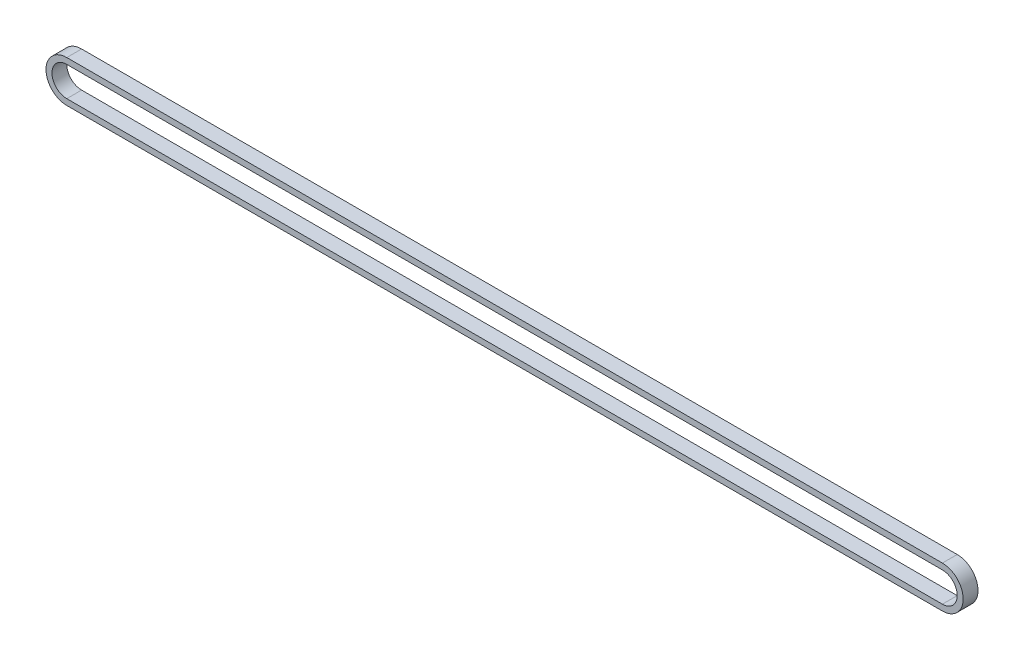
ISO-10303-21;
HEADER;
FILE_DESCRIPTION(('STEP AP214'),'2;1');
FILE_NAME('part.step','',(''),(''),'','','');
FILE_SCHEMA(('AUTOMOTIVE_DESIGN { 1 0 10303 214 1 1 1 1 }'));
ENDSEC;
DATA;
#1=APPLICATION_CONTEXT('core data for automotive mechanical design processes');
#2=APPLICATION_PROTOCOL_DEFINITION('international standard','automotive_design',2000,#1);
#3=PRODUCT_CONTEXT('',#1,'mechanical');
#4=PRODUCT('Part','Part','',(#3));
#5=PRODUCT_RELATED_PRODUCT_CATEGORY('part','',(#4));
#6=PRODUCT_DEFINITION_FORMATION('','',#4);
#7=PRODUCT_DEFINITION_CONTEXT('part definition',#1,'design');
#8=PRODUCT_DEFINITION('design','',#6,#7);
#9=PRODUCT_DEFINITION_SHAPE('','',#8);
#10=(LENGTH_UNIT() NAMED_UNIT(*) SI_UNIT(.MILLI.,.METRE.));
#11=(NAMED_UNIT(*) PLANE_ANGLE_UNIT() SI_UNIT($,.RADIAN.));
#12=(NAMED_UNIT(*) SI_UNIT($,.STERADIAN.) SOLID_ANGLE_UNIT());
#13=UNCERTAINTY_MEASURE_WITH_UNIT(LENGTH_MEASURE(1.E-05),#10,'distance_accuracy_value','');
#14=(GEOMETRIC_REPRESENTATION_CONTEXT(3) GLOBAL_UNCERTAINTY_ASSIGNED_CONTEXT((#13)) GLOBAL_UNIT_ASSIGNED_CONTEXT((#10,
#11,#12)) REPRESENTATION_CONTEXT('',''));
#15=CARTESIAN_POINT('',(0.,0.,0.));
#16=DIRECTION('',(0.,0.,1.));
#17=DIRECTION('',(1.,0.,0.));
#18=AXIS2_PLACEMENT_3D('',#15,#16,#17);
#19=CARTESIAN_POINT('',(-281.746298650699,144.119878603945,10.));
#20=DIRECTION('',(0.,0.,1.));
#21=DIRECTION('',(1.,0.,0.));
#22=AXIS2_PLACEMENT_3D('',#19,#20,#21);
#23=PLANE('',#22);
#24=CARTESIAN_POINT('',(-281.746298650699,144.119878603945,10.));
#25=DIRECTION('',(0.,0.,1.));
#26=DIRECTION('',(1.,0.,0.));
#27=AXIS2_PLACEMENT_3D('',#24,#25,#26);
#28=CIRCLE('',#27,14.);
#29=CARTESIAN_POINT('',(-281.746298650699,158.119878603945,10.));
#30=VERTEX_POINT('',#29);
#31=CARTESIAN_POINT('',(-281.746298650699,130.119878603945,10.));
#32=VERTEX_POINT('',#31);
#33=EDGE_CURVE('E134',#30,#32,#28,.T.);
#34=ORIENTED_EDGE('',*,*,#33,.T.);
#35=DIRECTION('',(1.,0.,0.));
#36=VECTOR('',#35,1.);
#37=CARTESIAN_POINT('',(-281.746298650699,130.119878603945,10.));
#38=LINE('',#37,#36);
#39=CARTESIAN_POINT('',(308.253701349301,130.119878603945,10.));
#40=VERTEX_POINT('',#39);
#41=EDGE_CURVE('E137',#32,#40,#38,.T.);
#42=ORIENTED_EDGE('',*,*,#41,.T.);
#43=CARTESIAN_POINT('',(308.253701349301,144.119878603945,10.));
#44=DIRECTION('',(0.,0.,1.));
#45=DIRECTION('',(-1.,0.,0.));
#46=AXIS2_PLACEMENT_3D('',#43,#44,#45);
#47=CIRCLE('',#46,14.);
#48=CARTESIAN_POINT('',(308.253701349301,158.119878603945,10.));
#49=VERTEX_POINT('',#48);
#50=EDGE_CURVE('E140',#40,#49,#47,.T.);
#51=ORIENTED_EDGE('',*,*,#50,.T.);
#52=DIRECTION('',(-1.,0.,0.));
#53=VECTOR('',#52,1.);
#54=CARTESIAN_POINT('',(-281.746298650699,158.119878603945,10.));
#55=LINE('',#54,#53);
#56=EDGE_CURVE('E142',#49,#30,#55,.T.);
#57=ORIENTED_EDGE('',*,*,#56,.T.);
#58=EDGE_LOOP('',(#34,#42,#51,#57));
#59=FACE_BOUND('',#58,.T.);
#60=DIRECTION('',(1.,0.,0.));
#61=VECTOR('',#60,1.);
#62=CARTESIAN_POINT('',(-281.746298650699,134.119878603945,10.));
#63=LINE('',#62,#61);
#64=CARTESIAN_POINT('',(-281.746298650699,134.119878603945,10.));
#65=VERTEX_POINT('',#64);
#66=CARTESIAN_POINT('',(308.253701349301,134.119878603945,10.));
#67=VERTEX_POINT('',#66);
#68=EDGE_CURVE('E106',#65,#67,#63,.T.);
#69=ORIENTED_EDGE('',*,*,#68,.F.);
#70=CARTESIAN_POINT('',(-281.746298650699,144.119878603945,10.));
#71=DIRECTION('',(0.,0.,1.));
#72=DIRECTION('',(1.,0.,0.));
#73=AXIS2_PLACEMENT_3D('',#70,#71,#72);
#74=CIRCLE('',#73,10.);
#75=CARTESIAN_POINT('',(-281.746298650699,154.119878603945,10.));
#76=VERTEX_POINT('',#75);
#77=EDGE_CURVE('E98',#76,#65,#74,.T.);
#78=ORIENTED_EDGE('',*,*,#77,.F.);
#79=DIRECTION('',(-1.,0.,0.));
#80=VECTOR('',#79,1.);
#81=CARTESIAN_POINT('',(-281.746298650699,154.119878603945,10.));
#82=LINE('',#81,#80);
#83=CARTESIAN_POINT('',(308.253701349301,154.119878603945,10.));
#84=VERTEX_POINT('',#83);
#85=EDGE_CURVE('E120',#84,#76,#82,.T.);
#86=ORIENTED_EDGE('',*,*,#85,.F.);
#87=CARTESIAN_POINT('',(308.253701349301,144.119878603945,10.));
#88=DIRECTION('',(0.,0.,1.));
#89=DIRECTION('',(-1.,0.,0.));
#90=AXIS2_PLACEMENT_3D('',#87,#88,#89);
#91=CIRCLE('',#90,10.);
#92=EDGE_CURVE('E118',#67,#84,#91,.T.);
#93=ORIENTED_EDGE('',*,*,#92,.F.);
#94=EDGE_LOOP('',(#69,#78,#86,#93));
#95=FACE_BOUND('',#94,.T.);
#96=ADVANCED_FACE('F33',(#59,#95),#23,.T.);
#97=CARTESIAN_POINT('',(-281.746298650699,144.119878603945,0.));
#98=DIRECTION('',(0.,0.,1.));
#99=DIRECTION('',(1.,0.,0.));
#100=AXIS2_PLACEMENT_3D('',#97,#98,#99);
#101=PLANE('',#100);
#102=CARTESIAN_POINT('',(-281.746298650699,144.119878603945,0.));
#103=DIRECTION('',(0.,0.,1.));
#104=DIRECTION('',(1.,0.,0.));
#105=AXIS2_PLACEMENT_3D('',#102,#103,#104);
#106=CIRCLE('',#105,14.);
#107=CARTESIAN_POINT('',(-281.746298650699,158.119878603945,0.));
#108=VERTEX_POINT('',#107);
#109=CARTESIAN_POINT('',(-281.746298650699,130.119878603945,0.));
#110=VERTEX_POINT('',#109);
#111=EDGE_CURVE('E114',#108,#110,#106,.T.);
#112=ORIENTED_EDGE('',*,*,#111,.F.);
#113=DIRECTION('',(-1.,0.,0.));
#114=VECTOR('',#113,1.);
#115=CARTESIAN_POINT('',(-281.746298650699,158.119878603945,0.));
#116=LINE('',#115,#114);
#117=CARTESIAN_POINT('',(308.253701349301,158.119878603945,0.));
#118=VERTEX_POINT('',#117);
#119=EDGE_CURVE('E138',#118,#108,#116,.T.);
#120=ORIENTED_EDGE('',*,*,#119,.F.);
#121=CARTESIAN_POINT('',(308.253701349301,144.119878603945,0.));
#122=DIRECTION('',(0.,0.,1.));
#123=DIRECTION('',(-1.,0.,0.));
#124=AXIS2_PLACEMENT_3D('',#121,#122,#123);
#125=CIRCLE('',#124,14.);
#126=CARTESIAN_POINT('',(308.253701349301,130.119878603945,0.));
#127=VERTEX_POINT('',#126);
#128=EDGE_CURVE('E149',#127,#118,#125,.T.);
#129=ORIENTED_EDGE('',*,*,#128,.F.);
#130=DIRECTION('',(1.,0.,0.));
#131=VECTOR('',#130,1.);
#132=CARTESIAN_POINT('',(-281.746298650699,130.119878603945,0.));
#133=LINE('',#132,#131);
#134=EDGE_CURVE('E147',#110,#127,#133,.T.);
#135=ORIENTED_EDGE('',*,*,#134,.F.);
#136=EDGE_LOOP('',(#112,#120,#129,#135));
#137=FACE_BOUND('',#136,.T.);
#138=CARTESIAN_POINT('',(-281.746298650699,144.119878603945,0.));
#139=DIRECTION('',(0.,0.,1.));
#140=DIRECTION('',(1.,0.,0.));
#141=AXIS2_PLACEMENT_3D('',#138,#139,#140);
#142=CIRCLE('',#141,10.);
#143=CARTESIAN_POINT('',(-281.746298650699,154.119878603945,0.));
#144=VERTEX_POINT('',#143);
#145=CARTESIAN_POINT('',(-281.746298650699,134.119878603945,0.));
#146=VERTEX_POINT('',#145);
#147=EDGE_CURVE('E56',#144,#146,#142,.T.);
#148=ORIENTED_EDGE('',*,*,#147,.T.);
#149=DIRECTION('',(1.,0.,0.));
#150=VECTOR('',#149,1.);
#151=CARTESIAN_POINT('',(-281.746298650699,134.119878603945,0.));
#152=LINE('',#151,#150);
#153=CARTESIAN_POINT('',(308.253701349301,134.119878603945,0.));
#154=VERTEX_POINT('',#153);
#155=EDGE_CURVE('E113',#146,#154,#152,.T.);
#156=ORIENTED_EDGE('',*,*,#155,.T.);
#157=CARTESIAN_POINT('',(308.253701349301,144.119878603945,0.));
#158=DIRECTION('',(0.,0.,1.));
#159=DIRECTION('',(-1.,0.,0.));
#160=AXIS2_PLACEMENT_3D('',#157,#158,#159);
#161=CIRCLE('',#160,10.);
#162=CARTESIAN_POINT('',(308.253701349301,154.119878603945,0.));
#163=VERTEX_POINT('',#162);
#164=EDGE_CURVE('E126',#154,#163,#161,.T.);
#165=ORIENTED_EDGE('',*,*,#164,.T.);
#166=DIRECTION('',(-1.,0.,0.));
#167=VECTOR('',#166,1.);
#168=CARTESIAN_POINT('',(-281.746298650699,154.119878603945,0.));
#169=LINE('',#168,#167);
#170=EDGE_CURVE('E107',#163,#144,#169,.T.);
#171=ORIENTED_EDGE('',*,*,#170,.T.);
#172=EDGE_LOOP('',(#148,#156,#165,#171));
#173=FACE_BOUND('',#172,.T.);
#174=ADVANCED_FACE('F167',(#137,#173),#101,.F.);
#175=CARTESIAN_POINT('',(-281.746298650699,144.119878603945,10.));
#176=DIRECTION('',(0.,0.,-1.));
#177=DIRECTION('',(-1.,0.,0.));
#178=AXIS2_PLACEMENT_3D('',#175,#176,#177);
#179=CYLINDRICAL_SURFACE('',#178,14.);
#180=ORIENTED_EDGE('',*,*,#111,.T.);
#181=DIRECTION('',(0.,0.,-1.));
#182=VECTOR('',#181,1.);
#183=CARTESIAN_POINT('',(-281.746298650699,130.119878603945,10.));
#184=LINE('',#183,#182);
#185=EDGE_CURVE('E11',#32,#110,#184,.T.);
#186=ORIENTED_EDGE('',*,*,#185,.F.);
#187=ORIENTED_EDGE('',*,*,#33,.F.);
#188=DIRECTION('',(0.,0.,-1.));
#189=VECTOR('',#188,1.);
#190=CARTESIAN_POINT('',(-281.746298650699,158.119878603945,10.));
#191=LINE('',#190,#189);
#192=EDGE_CURVE('E144',#30,#108,#191,.T.);
#193=ORIENTED_EDGE('',*,*,#192,.T.);
#194=EDGE_LOOP('',(#180,#186,#187,#193));
#195=FACE_BOUND('',#194,.T.);
#196=ADVANCED_FACE('F35',(#195),#179,.T.);
#197=CARTESIAN_POINT('',(-281.746298650699,130.119878603945,10.));
#198=DIRECTION('',(0.,1.,0.));
#199=DIRECTION('',(0.,0.,1.));
#200=AXIS2_PLACEMENT_3D('',#197,#198,#199);
#201=PLANE('',#200);
#202=ORIENTED_EDGE('',*,*,#134,.T.);
#203=DIRECTION('',(0.,0.,-1.));
#204=VECTOR('',#203,1.);
#205=CARTESIAN_POINT('',(308.253701349301,130.119878603945,10.));
#206=LINE('',#205,#204);
#207=EDGE_CURVE('E41',#40,#127,#206,.T.);
#208=ORIENTED_EDGE('',*,*,#207,.F.);
#209=ORIENTED_EDGE('',*,*,#41,.F.);
#210=ORIENTED_EDGE('',*,*,#185,.T.);
#211=EDGE_LOOP('',(#202,#208,#209,#210));
#212=FACE_BOUND('',#211,.T.);
#213=ADVANCED_FACE('F177',(#212),#201,.F.);
#214=CARTESIAN_POINT('',(308.253701349301,144.119878603945,10.));
#215=DIRECTION('',(0.,0.,-1.));
#216=DIRECTION('',(-1.,0.,0.));
#217=AXIS2_PLACEMENT_3D('',#214,#215,#216);
#218=CYLINDRICAL_SURFACE('',#217,14.);
#219=ORIENTED_EDGE('',*,*,#128,.T.);
#220=DIRECTION('',(0.,0.,-1.));
#221=VECTOR('',#220,1.);
#222=CARTESIAN_POINT('',(308.253701349301,158.119878603945,10.));
#223=LINE('',#222,#221);
#224=EDGE_CURVE('E154',#49,#118,#223,.T.);
#225=ORIENTED_EDGE('',*,*,#224,.F.);
#226=ORIENTED_EDGE('',*,*,#50,.F.);
#227=ORIENTED_EDGE('',*,*,#207,.T.);
#228=EDGE_LOOP('',(#219,#225,#226,#227));
#229=FACE_BOUND('',#228,.T.);
#230=ADVANCED_FACE('F161',(#229),#218,.T.);
#231=CARTESIAN_POINT('',(-281.746298650699,158.119878603945,10.));
#232=DIRECTION('',(0.,-1.,0.));
#233=DIRECTION('',(0.,0.,-1.));
#234=AXIS2_PLACEMENT_3D('',#231,#232,#233);
#235=PLANE('',#234);
#236=ORIENTED_EDGE('',*,*,#119,.T.);
#237=ORIENTED_EDGE('',*,*,#192,.F.);
#238=ORIENTED_EDGE('',*,*,#56,.F.);
#239=ORIENTED_EDGE('',*,*,#224,.T.);
#240=EDGE_LOOP('',(#236,#237,#238,#239));
#241=FACE_BOUND('',#240,.T.);
#242=ADVANCED_FACE('F171',(#241),#235,.F.);
#243=CARTESIAN_POINT('',(-281.746298650699,144.119878603945,10.));
#244=DIRECTION('',(0.,0.,-1.));
#245=DIRECTION('',(-1.,0.,0.));
#246=AXIS2_PLACEMENT_3D('',#243,#244,#245);
#247=CYLINDRICAL_SURFACE('',#246,10.);
#248=ORIENTED_EDGE('',*,*,#147,.F.);
#249=DIRECTION('',(0.,0.,-1.));
#250=VECTOR('',#249,1.);
#251=CARTESIAN_POINT('',(-281.746298650699,154.119878603945,10.));
#252=LINE('',#251,#250);
#253=EDGE_CURVE('E102',#76,#144,#252,.T.);
#254=ORIENTED_EDGE('',*,*,#253,.F.);
#255=ORIENTED_EDGE('',*,*,#77,.T.);
#256=DIRECTION('',(0.,0.,-1.));
#257=VECTOR('',#256,1.);
#258=CARTESIAN_POINT('',(-281.746298650699,134.119878603945,10.));
#259=LINE('',#258,#257);
#260=EDGE_CURVE('E101',#65,#146,#259,.T.);
#261=ORIENTED_EDGE('',*,*,#260,.T.);
#262=EDGE_LOOP('',(#248,#254,#255,#261));
#263=FACE_BOUND('',#262,.T.);
#264=ADVANCED_FACE('F100',(#263),#247,.F.);
#265=CARTESIAN_POINT('',(-281.746298650699,134.119878603945,10.));
#266=DIRECTION('',(0.,1.,0.));
#267=DIRECTION('',(-1.,0.,0.));
#268=AXIS2_PLACEMENT_3D('',#265,#266,#267);
#269=PLANE('',#268);
#270=ORIENTED_EDGE('',*,*,#155,.F.);
#271=ORIENTED_EDGE('',*,*,#260,.F.);
#272=ORIENTED_EDGE('',*,*,#68,.T.);
#273=DIRECTION('',(0.,0.,-1.));
#274=VECTOR('',#273,1.);
#275=CARTESIAN_POINT('',(308.253701349301,134.119878603945,10.));
#276=LINE('',#275,#274);
#277=EDGE_CURVE('E115',#67,#154,#276,.T.);
#278=ORIENTED_EDGE('',*,*,#277,.T.);
#279=EDGE_LOOP('',(#270,#271,#272,#278));
#280=FACE_BOUND('',#279,.T.);
#281=ADVANCED_FACE('F110',(#280),#269,.T.);
#282=CARTESIAN_POINT('',(308.253701349301,144.119878603945,10.));
#283=DIRECTION('',(0.,0.,-1.));
#284=DIRECTION('',(-1.,0.,0.));
#285=AXIS2_PLACEMENT_3D('',#282,#283,#284);
#286=CYLINDRICAL_SURFACE('',#285,10.);
#287=ORIENTED_EDGE('',*,*,#164,.F.);
#288=ORIENTED_EDGE('',*,*,#277,.F.);
#289=ORIENTED_EDGE('',*,*,#92,.T.);
#290=DIRECTION('',(0.,0.,-1.));
#291=VECTOR('',#290,1.);
#292=CARTESIAN_POINT('',(308.253701349301,154.119878603945,10.));
#293=LINE('',#292,#291);
#294=EDGE_CURVE('E48',#84,#163,#293,.T.);
#295=ORIENTED_EDGE('',*,*,#294,.T.);
#296=EDGE_LOOP('',(#287,#288,#289,#295));
#297=FACE_BOUND('',#296,.T.);
#298=ADVANCED_FACE('F200',(#297),#286,.F.);
#299=CARTESIAN_POINT('',(-281.746298650699,154.119878603945,10.));
#300=DIRECTION('',(0.,-1.,0.));
#301=DIRECTION('',(0.,0.,-1.));
#302=AXIS2_PLACEMENT_3D('',#299,#300,#301);
#303=PLANE('',#302);
#304=ORIENTED_EDGE('',*,*,#170,.F.);
#305=ORIENTED_EDGE('',*,*,#294,.F.);
#306=ORIENTED_EDGE('',*,*,#85,.T.);
#307=ORIENTED_EDGE('',*,*,#253,.T.);
#308=EDGE_LOOP('',(#304,#305,#306,#307));
#309=FACE_BOUND('',#308,.T.);
#310=ADVANCED_FACE('F204',(#309),#303,.T.);
#311=CLOSED_SHELL('',(#96,#174,#196,#213,#230,#242,#264,#281,#298,#310));
#312=MANIFOLD_SOLID_BREP('B2',#311);
#313=ADVANCED_BREP_SHAPE_REPRESENTATION('',(#18,#312),#14);
#314=SHAPE_DEFINITION_REPRESENTATION(#9,#313);
ENDSEC;
END-ISO-10303-21;
